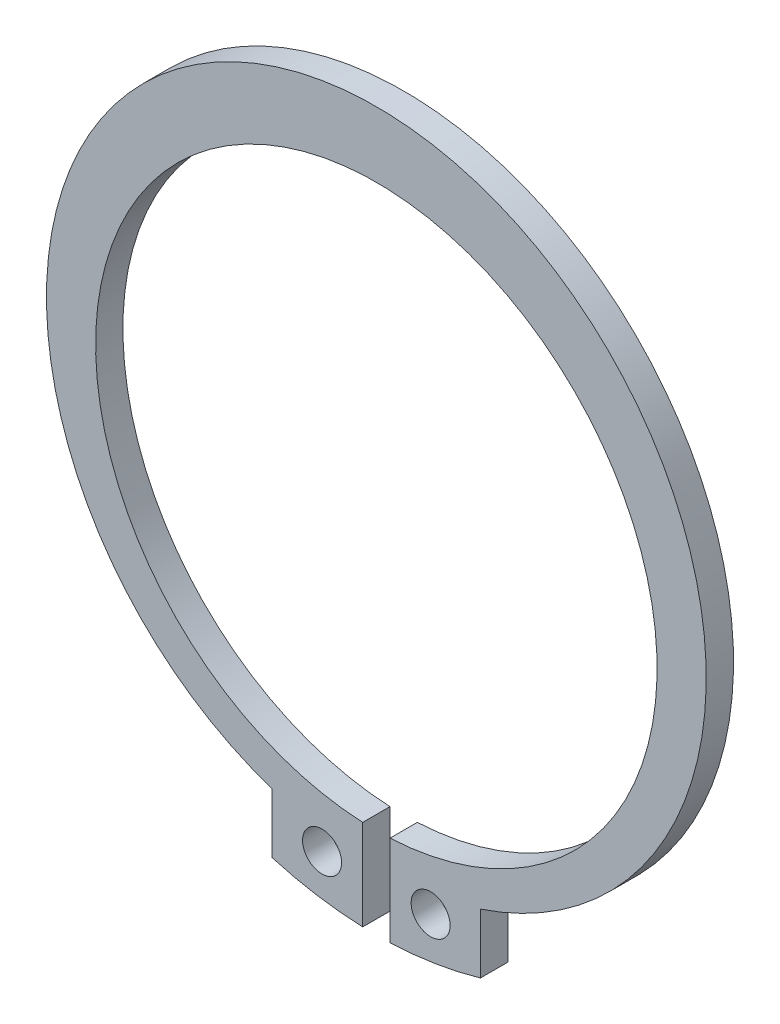
ISO-10303-21;
HEADER;
FILE_DESCRIPTION(('STEP AP214'),'2;1');
FILE_NAME('part.step','',(''),(''),'','','');
FILE_SCHEMA(('AUTOMOTIVE_DESIGN { 1 0 10303 214 1 1 1 1 }'));
ENDSEC;
DATA;
#1=APPLICATION_CONTEXT('core data for automotive mechanical design processes');
#2=APPLICATION_PROTOCOL_DEFINITION('international standard','automotive_design',2000,#1);
#3=PRODUCT_CONTEXT('',#1,'mechanical');
#4=PRODUCT('Part','Part','',(#3));
#5=PRODUCT_RELATED_PRODUCT_CATEGORY('part','',(#4));
#6=PRODUCT_DEFINITION_FORMATION('','',#4);
#7=PRODUCT_DEFINITION_CONTEXT('part definition',#1,'design');
#8=PRODUCT_DEFINITION('design','',#6,#7);
#9=PRODUCT_DEFINITION_SHAPE('','',#8);
#10=(LENGTH_UNIT() NAMED_UNIT(*) SI_UNIT(.MILLI.,.METRE.));
#11=(NAMED_UNIT(*) PLANE_ANGLE_UNIT() SI_UNIT($,.RADIAN.));
#12=(NAMED_UNIT(*) SI_UNIT($,.STERADIAN.) SOLID_ANGLE_UNIT());
#13=UNCERTAINTY_MEASURE_WITH_UNIT(LENGTH_MEASURE(1.E-05),#10,'distance_accuracy_value','');
#14=(GEOMETRIC_REPRESENTATION_CONTEXT(3) GLOBAL_UNCERTAINTY_ASSIGNED_CONTEXT((#13)) GLOBAL_UNIT_ASSIGNED_CONTEXT((#10,
#11,#12)) REPRESENTATION_CONTEXT('',''));
#15=CARTESIAN_POINT('',(0.,0.,0.));
#16=DIRECTION('',(0.,0.,1.));
#17=DIRECTION('',(1.,0.,0.));
#18=AXIS2_PLACEMENT_3D('',#15,#16,#17);
#19=CARTESIAN_POINT('',(0.,-2.58072414196304,0.));
#20=DIRECTION('',(0.,0.,1.));
#21=DIRECTION('',(1.,0.,0.));
#22=AXIS2_PLACEMENT_3D('',#19,#20,#21);
#23=PLANE('',#22);
#24=CARTESIAN_POINT('',(0.,0.,0.));
#25=DIRECTION('',(0.,0.,1.));
#26=DIRECTION('',(1.,0.,0.));
#27=AXIS2_PLACEMENT_3D('',#24,#25,#26);
#28=CIRCLE('',#27,18.);
#29=CARTESIAN_POINT('',(0.875,-17.9787200601155,0.));
#30=VERTEX_POINT('',#29);
#31=CARTESIAN_POINT('',(-0.875,-17.9787200601155,0.));
#32=VERTEX_POINT('',#31);
#33=EDGE_CURVE('E12',#30,#32,#28,.T.);
#34=ORIENTED_EDGE('',*,*,#33,.T.);
#35=DIRECTION('',(0.,1.,0.));
#36=VECTOR('',#35,1.);
#37=CARTESIAN_POINT('',(-0.875,-23.7839100023524,0.));
#38=LINE('',#37,#36);
#39=CARTESIAN_POINT('',(-0.875,-23.7839100023524,0.));
#40=VERTEX_POINT('',#39);
#41=EDGE_CURVE('E110',#40,#32,#38,.T.);
#42=ORIENTED_EDGE('',*,*,#41,.F.);
#43=CARTESIAN_POINT('',(0.,0.,0.));
#44=DIRECTION('',(0.,0.,1.));
#45=DIRECTION('',(1.,0.,0.));
#46=AXIS2_PLACEMENT_3D('',#43,#44,#45);
#47=CIRCLE('',#46,23.8);
#48=CARTESIAN_POINT('',(-6.675,-22.8447887930705,0.));
#49=VERTEX_POINT('',#48);
#50=EDGE_CURVE('E107',#49,#40,#47,.T.);
#51=ORIENTED_EDGE('',*,*,#50,.F.);
#52=DIRECTION('',(0.,1.,0.));
#53=VECTOR('',#52,1.);
#54=CARTESIAN_POINT('',(-6.675,-22.8447887930705,0.));
#55=LINE('',#54,#53);
#56=CARTESIAN_POINT('',(-6.675,-19.0190526682253,0.));
#57=VERTEX_POINT('',#56);
#58=EDGE_CURVE('E94',#49,#57,#55,.T.);
#59=ORIENTED_EDGE('',*,*,#58,.T.);
#60=CARTESIAN_POINT('',(0.,1.05,0.));
#61=DIRECTION('',(0.,0.,1.));
#62=DIRECTION('',(1.,0.,0.));
#63=AXIS2_PLACEMENT_3D('',#60,#61,#62);
#64=CIRCLE('',#63,21.15);
#65=CARTESIAN_POINT('',(6.675,-19.0190526682252,0.));
#66=VERTEX_POINT('',#65);
#67=EDGE_CURVE('E151',#66,#57,#64,.T.);
#68=ORIENTED_EDGE('',*,*,#67,.F.);
#69=DIRECTION('',(0.,1.,0.));
#70=VECTOR('',#69,1.);
#71=CARTESIAN_POINT('',(6.675,-22.8447887930705,0.));
#72=LINE('',#71,#70);
#73=CARTESIAN_POINT('',(6.675,-22.8447887930705,0.));
#74=VERTEX_POINT('',#73);
#75=EDGE_CURVE('E204',#74,#66,#72,.T.);
#76=ORIENTED_EDGE('',*,*,#75,.F.);
#77=CARTESIAN_POINT('',(0.,0.,0.));
#78=DIRECTION('',(0.,0.,1.));
#79=DIRECTION('',(1.,0.,0.));
#80=AXIS2_PLACEMENT_3D('',#77,#78,#79);
#81=CIRCLE('',#80,23.8);
#82=CARTESIAN_POINT('',(0.875,-23.7839100023524,0.));
#83=VERTEX_POINT('',#82);
#84=EDGE_CURVE('E121',#83,#74,#81,.T.);
#85=ORIENTED_EDGE('',*,*,#84,.F.);
#86=DIRECTION('',(0.,1.,0.));
#87=VECTOR('',#86,1.);
#88=CARTESIAN_POINT('',(0.875,-23.7839100023524,0.));
#89=LINE('',#88,#87);
#90=EDGE_CURVE('E171',#83,#30,#89,.T.);
#91=ORIENTED_EDGE('',*,*,#90,.T.);
#92=EDGE_LOOP('',(#34,#42,#51,#59,#68,#76,#85,#91));
#93=FACE_BOUND('',#92,.T.);
#94=CARTESIAN_POINT('',(-3.48,-20.9,0.));
#95=DIRECTION('',(0.,0.,1.));
#96=DIRECTION('',(1.,0.,0.));
#97=AXIS2_PLACEMENT_3D('',#94,#95,#96);
#98=CIRCLE('',#97,1.25);
#99=CARTESIAN_POINT('',(-4.73,-20.9,0.));
#100=VERTEX_POINT('',#99);
#101=EDGE_CURVE('E186',#100,#100,#98,.T.);
#102=ORIENTED_EDGE('',*,*,#101,.T.);
#103=EDGE_LOOP('',(#102));
#104=FACE_BOUND('',#103,.T.);
#105=CARTESIAN_POINT('',(3.48,-20.9,0.));
#106=DIRECTION('',(0.,0.,1.));
#107=DIRECTION('',(1.,0.,0.));
#108=AXIS2_PLACEMENT_3D('',#105,#106,#107);
#109=CIRCLE('',#108,1.25);
#110=CARTESIAN_POINT('',(2.23,-20.9,0.));
#111=VERTEX_POINT('',#110);
#112=EDGE_CURVE('E24',#111,#111,#109,.T.);
#113=ORIENTED_EDGE('',*,*,#112,.T.);
#114=EDGE_LOOP('',(#113));
#115=FACE_BOUND('',#114,.T.);
#116=ADVANCED_FACE('F20',(#93,#104,#115),#23,.F.);
#117=CARTESIAN_POINT('',(0.,-2.58072414196304,1.75));
#118=DIRECTION('',(0.,0.,1.));
#119=DIRECTION('',(1.,0.,0.));
#120=AXIS2_PLACEMENT_3D('',#117,#118,#119);
#121=PLANE('',#120);
#122=DIRECTION('',(0.,-1.,0.));
#123=VECTOR('',#122,1.);
#124=CARTESIAN_POINT('',(-0.875,-23.7839100023524,1.75));
#125=LINE('',#124,#123);
#126=CARTESIAN_POINT('',(-0.875,-17.9787200601155,1.75));
#127=VERTEX_POINT('',#126);
#128=CARTESIAN_POINT('',(-0.875,-23.7839100023524,1.75));
#129=VERTEX_POINT('',#128);
#130=EDGE_CURVE('E125',#127,#129,#125,.T.);
#131=ORIENTED_EDGE('',*,*,#130,.F.);
#132=CARTESIAN_POINT('',(0.,0.,1.75));
#133=DIRECTION('',(0.,0.,1.));
#134=DIRECTION('',(1.,0.,0.));
#135=AXIS2_PLACEMENT_3D('',#132,#133,#134);
#136=CIRCLE('',#135,18.);
#137=CARTESIAN_POINT('',(0.875,-17.9787200601155,1.75));
#138=VERTEX_POINT('',#137);
#139=EDGE_CURVE('E31',#138,#127,#136,.T.);
#140=ORIENTED_EDGE('',*,*,#139,.F.);
#141=DIRECTION('',(0.,1.,0.));
#142=VECTOR('',#141,1.);
#143=CARTESIAN_POINT('',(0.875,-23.7839100023524,1.75));
#144=LINE('',#143,#142);
#145=CARTESIAN_POINT('',(0.875,-23.7839100023524,1.75));
#146=VERTEX_POINT('',#145);
#147=EDGE_CURVE('E126',#146,#138,#144,.T.);
#148=ORIENTED_EDGE('',*,*,#147,.F.);
#149=CARTESIAN_POINT('',(0.,0.,1.75));
#150=DIRECTION('',(0.,0.,-1.));
#151=DIRECTION('',(1.,0.,0.));
#152=AXIS2_PLACEMENT_3D('',#149,#150,#151);
#153=CIRCLE('',#152,23.8);
#154=CARTESIAN_POINT('',(6.675,-22.8447887930705,1.75));
#155=VERTEX_POINT('',#154);
#156=EDGE_CURVE('E200',#155,#146,#153,.T.);
#157=ORIENTED_EDGE('',*,*,#156,.F.);
#158=DIRECTION('',(0.,-1.,0.));
#159=VECTOR('',#158,1.);
#160=CARTESIAN_POINT('',(6.675,-22.8447887930705,1.75));
#161=LINE('',#160,#159);
#162=CARTESIAN_POINT('',(6.675,-19.0190526682252,1.75));
#163=VERTEX_POINT('',#162);
#164=EDGE_CURVE('E145',#163,#155,#161,.T.);
#165=ORIENTED_EDGE('',*,*,#164,.F.);
#166=CARTESIAN_POINT('',(0.,1.05,1.75));
#167=DIRECTION('',(0.,0.,-1.));
#168=DIRECTION('',(1.,0.,0.));
#169=AXIS2_PLACEMENT_3D('',#166,#167,#168);
#170=CIRCLE('',#169,21.15);
#171=CARTESIAN_POINT('',(-6.675,-19.0190526682253,1.75));
#172=VERTEX_POINT('',#171);
#173=EDGE_CURVE('E104',#172,#163,#170,.T.);
#174=ORIENTED_EDGE('',*,*,#173,.F.);
#175=DIRECTION('',(0.,1.,0.));
#176=VECTOR('',#175,1.);
#177=CARTESIAN_POINT('',(-6.675,-22.8447887930705,1.75));
#178=LINE('',#177,#176);
#179=CARTESIAN_POINT('',(-6.675,-22.8447887930705,1.75));
#180=VERTEX_POINT('',#179);
#181=EDGE_CURVE('E114',#180,#172,#178,.T.);
#182=ORIENTED_EDGE('',*,*,#181,.F.);
#183=CARTESIAN_POINT('',(0.,0.,1.75));
#184=DIRECTION('',(0.,0.,-1.));
#185=DIRECTION('',(1.,0.,0.));
#186=AXIS2_PLACEMENT_3D('',#183,#184,#185);
#187=CIRCLE('',#186,23.8);
#188=EDGE_CURVE('E116',#129,#180,#187,.T.);
#189=ORIENTED_EDGE('',*,*,#188,.F.);
#190=EDGE_LOOP('',(#131,#140,#148,#157,#165,#174,#182,#189));
#191=FACE_BOUND('',#190,.T.);
#192=CARTESIAN_POINT('',(-3.48,-20.9,1.75));
#193=DIRECTION('',(0.,0.,-1.));
#194=DIRECTION('',(1.,0.,0.));
#195=AXIS2_PLACEMENT_3D('',#192,#193,#194);
#196=CIRCLE('',#195,1.25);
#197=CARTESIAN_POINT('',(-4.73,-20.9,1.75));
#198=VERTEX_POINT('',#197);
#199=EDGE_CURVE('E162',#198,#198,#196,.T.);
#200=ORIENTED_EDGE('',*,*,#199,.T.);
#201=EDGE_LOOP('',(#200));
#202=FACE_BOUND('',#201,.T.);
#203=CARTESIAN_POINT('',(3.48,-20.9,1.75));
#204=DIRECTION('',(0.,0.,-1.));
#205=DIRECTION('',(1.,0.,0.));
#206=AXIS2_PLACEMENT_3D('',#203,#204,#205);
#207=CIRCLE('',#206,1.25);
#208=CARTESIAN_POINT('',(2.23,-20.9,1.75));
#209=VERTEX_POINT('',#208);
#210=EDGE_CURVE('E188',#209,#209,#207,.T.);
#211=ORIENTED_EDGE('',*,*,#210,.T.);
#212=EDGE_LOOP('',(#211));
#213=FACE_BOUND('',#212,.T.);
#214=ADVANCED_FACE('F232',(#191,#202,#213),#121,.T.);
#215=CARTESIAN_POINT('',(0.,0.,0.));
#216=DIRECTION('',(0.,0.,-1.));
#217=DIRECTION('',(1.,0.,0.));
#218=AXIS2_PLACEMENT_3D('',#215,#216,#217);
#219=CYLINDRICAL_SURFACE('',#218,18.);
#220=ORIENTED_EDGE('',*,*,#139,.T.);
#221=DIRECTION('',(0.,0.,1.));
#222=VECTOR('',#221,1.);
#223=CARTESIAN_POINT('',(-0.875,-17.9787200601155,0.));
#224=LINE('',#223,#222);
#225=EDGE_CURVE('E118',#32,#127,#224,.T.);
#226=ORIENTED_EDGE('',*,*,#225,.F.);
#227=ORIENTED_EDGE('',*,*,#33,.F.);
#228=DIRECTION('',(0.,0.,1.));
#229=VECTOR('',#228,1.);
#230=CARTESIAN_POINT('',(0.875,-17.9787200601155,0.));
#231=LINE('',#230,#229);
#232=EDGE_CURVE('E130',#30,#138,#231,.T.);
#233=ORIENTED_EDGE('',*,*,#232,.T.);
#234=EDGE_LOOP('',(#220,#226,#227,#233));
#235=FACE_BOUND('',#234,.T.);
#236=ADVANCED_FACE('F227',(#235),#219,.F.);
#237=CARTESIAN_POINT('',(0.875,-20.881315031234,0.));
#238=DIRECTION('',(-1.,0.,0.));
#239=DIRECTION('',(0.,-1.,0.));
#240=AXIS2_PLACEMENT_3D('',#237,#238,#239);
#241=PLANE('',#240);
#242=ORIENTED_EDGE('',*,*,#147,.T.);
#243=ORIENTED_EDGE('',*,*,#232,.F.);
#244=ORIENTED_EDGE('',*,*,#90,.F.);
#245=DIRECTION('',(0.,0.,1.));
#246=VECTOR('',#245,1.);
#247=CARTESIAN_POINT('',(0.875,-23.7839100023524,0.));
#248=LINE('',#247,#246);
#249=EDGE_CURVE('E152',#83,#146,#248,.T.);
#250=ORIENTED_EDGE('',*,*,#249,.T.);
#251=EDGE_LOOP('',(#242,#243,#244,#250));
#252=FACE_BOUND('',#251,.T.);
#253=ADVANCED_FACE('F225',(#252),#241,.T.);
#254=CARTESIAN_POINT('',(0.,0.,0.));
#255=DIRECTION('',(0.,0.,-1.));
#256=DIRECTION('',(1.,0.,0.));
#257=AXIS2_PLACEMENT_3D('',#254,#255,#256);
#258=CYLINDRICAL_SURFACE('',#257,23.8);
#259=ORIENTED_EDGE('',*,*,#156,.T.);
#260=ORIENTED_EDGE('',*,*,#249,.F.);
#261=ORIENTED_EDGE('',*,*,#84,.T.);
#262=DIRECTION('',(0.,0.,1.));
#263=VECTOR('',#262,1.);
#264=CARTESIAN_POINT('',(6.675,-22.8447887930705,0.));
#265=LINE('',#264,#263);
#266=EDGE_CURVE('E150',#74,#155,#265,.T.);
#267=ORIENTED_EDGE('',*,*,#266,.T.);
#268=EDGE_LOOP('',(#259,#260,#261,#267));
#269=FACE_BOUND('',#268,.T.);
#270=ADVANCED_FACE('F222',(#269),#258,.T.);
#271=CARTESIAN_POINT('',(6.675,-20.9319207306479,0.));
#272=DIRECTION('',(1.,0.,0.));
#273=DIRECTION('',(0.,1.,0.));
#274=AXIS2_PLACEMENT_3D('',#271,#272,#273);
#275=PLANE('',#274);
#276=ORIENTED_EDGE('',*,*,#164,.T.);
#277=ORIENTED_EDGE('',*,*,#266,.F.);
#278=ORIENTED_EDGE('',*,*,#75,.T.);
#279=DIRECTION('',(0.,0.,1.));
#280=VECTOR('',#279,1.);
#281=CARTESIAN_POINT('',(6.675,-19.0190526682252,0.));
#282=LINE('',#281,#280);
#283=EDGE_CURVE('E165',#66,#163,#282,.T.);
#284=ORIENTED_EDGE('',*,*,#283,.T.);
#285=EDGE_LOOP('',(#276,#277,#278,#284));
#286=FACE_BOUND('',#285,.T.);
#287=ADVANCED_FACE('F220',(#286),#275,.T.);
#288=CARTESIAN_POINT('',(0.,1.05,0.));
#289=DIRECTION('',(0.,0.,-1.));
#290=DIRECTION('',(1.,0.,0.));
#291=AXIS2_PLACEMENT_3D('',#288,#289,#290);
#292=CYLINDRICAL_SURFACE('',#291,21.15);
#293=ORIENTED_EDGE('',*,*,#173,.T.);
#294=ORIENTED_EDGE('',*,*,#283,.F.);
#295=ORIENTED_EDGE('',*,*,#67,.T.);
#296=DIRECTION('',(0.,0.,1.));
#297=VECTOR('',#296,1.);
#298=CARTESIAN_POINT('',(-6.675,-19.0190526682253,0.));
#299=LINE('',#298,#297);
#300=EDGE_CURVE('E101',#57,#172,#299,.T.);
#301=ORIENTED_EDGE('',*,*,#300,.T.);
#302=EDGE_LOOP('',(#293,#294,#295,#301));
#303=FACE_BOUND('',#302,.T.);
#304=ADVANCED_FACE('F213',(#303),#292,.T.);
#305=CARTESIAN_POINT('',(-6.675,-20.9319207306479,0.));
#306=DIRECTION('',(-1.,0.,0.));
#307=DIRECTION('',(0.,-1.,0.));
#308=AXIS2_PLACEMENT_3D('',#305,#306,#307);
#309=PLANE('',#308);
#310=ORIENTED_EDGE('',*,*,#181,.T.);
#311=ORIENTED_EDGE('',*,*,#300,.F.);
#312=ORIENTED_EDGE('',*,*,#58,.F.);
#313=DIRECTION('',(0.,0.,1.));
#314=VECTOR('',#313,1.);
#315=CARTESIAN_POINT('',(-6.675,-22.8447887930705,0.));
#316=LINE('',#315,#314);
#317=EDGE_CURVE('E98',#49,#180,#316,.T.);
#318=ORIENTED_EDGE('',*,*,#317,.T.);
#319=EDGE_LOOP('',(#310,#311,#312,#318));
#320=FACE_BOUND('',#319,.T.);
#321=ADVANCED_FACE('F22',(#320),#309,.T.);
#322=CARTESIAN_POINT('',(0.,0.,0.));
#323=DIRECTION('',(0.,0.,-1.));
#324=DIRECTION('',(1.,0.,0.));
#325=AXIS2_PLACEMENT_3D('',#322,#323,#324);
#326=CYLINDRICAL_SURFACE('',#325,23.8);
#327=ORIENTED_EDGE('',*,*,#188,.T.);
#328=ORIENTED_EDGE('',*,*,#317,.F.);
#329=ORIENTED_EDGE('',*,*,#50,.T.);
#330=DIRECTION('',(0.,0.,1.));
#331=VECTOR('',#330,1.);
#332=CARTESIAN_POINT('',(-0.875,-23.7839100023524,0.));
#333=LINE('',#332,#331);
#334=EDGE_CURVE('E123',#40,#129,#333,.T.);
#335=ORIENTED_EDGE('',*,*,#334,.T.);
#336=EDGE_LOOP('',(#327,#328,#329,#335));
#337=FACE_BOUND('',#336,.T.);
#338=ADVANCED_FACE('F115',(#337),#326,.T.);
#339=CARTESIAN_POINT('',(-0.875,-20.8813150312339,0.));
#340=DIRECTION('',(1.,0.,0.));
#341=DIRECTION('',(0.,1.,0.));
#342=AXIS2_PLACEMENT_3D('',#339,#340,#341);
#343=PLANE('',#342);
#344=ORIENTED_EDGE('',*,*,#130,.T.);
#345=ORIENTED_EDGE('',*,*,#334,.F.);
#346=ORIENTED_EDGE('',*,*,#41,.T.);
#347=ORIENTED_EDGE('',*,*,#225,.T.);
#348=EDGE_LOOP('',(#344,#345,#346,#347));
#349=FACE_BOUND('',#348,.T.);
#350=ADVANCED_FACE('F230',(#349),#343,.T.);
#351=CARTESIAN_POINT('',(-3.48,-20.9,0.875));
#352=DIRECTION('',(0.,0.,-1.));
#353=DIRECTION('',(1.,0.,0.));
#354=AXIS2_PLACEMENT_3D('',#351,#352,#353);
#355=CYLINDRICAL_SURFACE('',#354,1.25);
#356=ORIENTED_EDGE('',*,*,#199,.F.);
#357=EDGE_LOOP('',(#356));
#358=FACE_BOUND('',#357,.T.);
#359=ORIENTED_EDGE('',*,*,#101,.F.);
#360=EDGE_LOOP('',(#359));
#361=FACE_BOUND('',#360,.T.);
#362=ADVANCED_FACE('F243',(#358,#361),#355,.F.);
#363=CARTESIAN_POINT('',(3.48,-20.9,0.875));
#364=DIRECTION('',(0.,0.,-1.));
#365=DIRECTION('',(1.,0.,0.));
#366=AXIS2_PLACEMENT_3D('',#363,#364,#365);
#367=CYLINDRICAL_SURFACE('',#366,1.25);
#368=ORIENTED_EDGE('',*,*,#210,.F.);
#369=EDGE_LOOP('',(#368));
#370=FACE_BOUND('',#369,.T.);
#371=ORIENTED_EDGE('',*,*,#112,.F.);
#372=EDGE_LOOP('',(#371));
#373=FACE_BOUND('',#372,.T.);
#374=ADVANCED_FACE('F240',(#370,#373),#367,.F.);
#375=CLOSED_SHELL('',(#116,#214,#236,#253,#270,#287,#304,#321,#338,#350,#362,#374));
#376=MANIFOLD_SOLID_BREP('B1',#375);
#377=ADVANCED_BREP_SHAPE_REPRESENTATION('',(#18,#376),#14);
#378=SHAPE_DEFINITION_REPRESENTATION(#9,#377);
ENDSEC;
END-ISO-10303-21;
